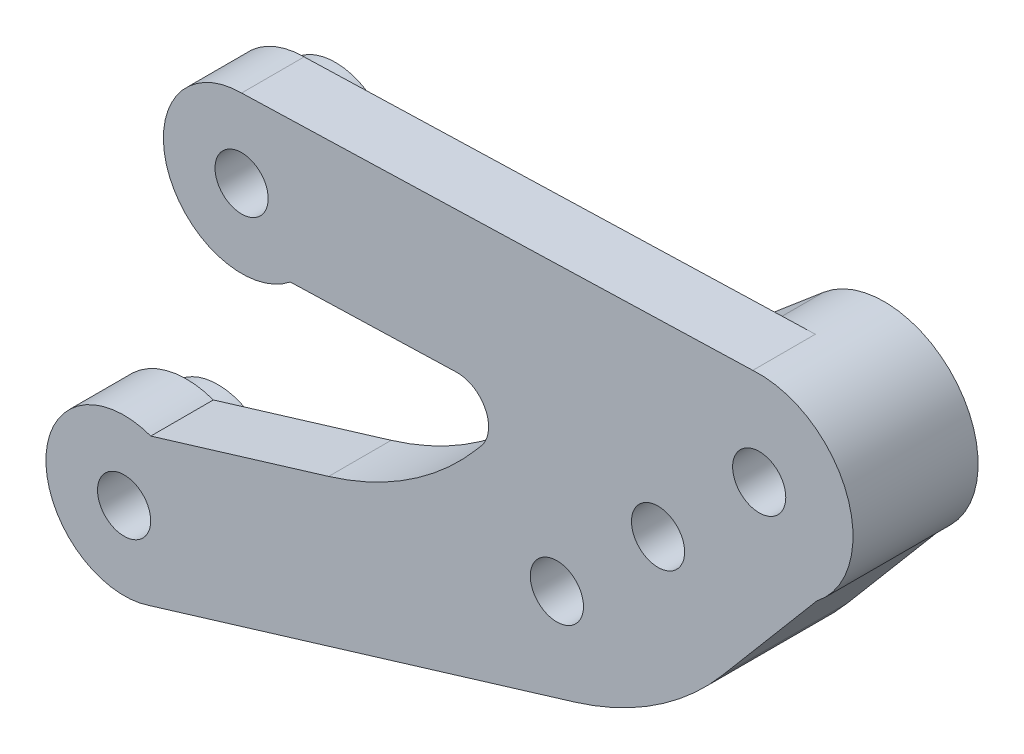
ISO-10303-21;
HEADER;
FILE_DESCRIPTION(('STEP AP214'),'2;1');
FILE_NAME('part.step','',(''),(''),'','','');
FILE_SCHEMA(('AUTOMOTIVE_DESIGN { 1 0 10303 214 1 1 1 1 }'));
ENDSEC;
DATA;
#1=APPLICATION_CONTEXT('core data for automotive mechanical design processes');
#2=APPLICATION_PROTOCOL_DEFINITION('international standard','automotive_design',2000,#1);
#3=PRODUCT_CONTEXT('',#1,'mechanical');
#4=PRODUCT('Part','Part','',(#3));
#5=PRODUCT_RELATED_PRODUCT_CATEGORY('part','',(#4));
#6=PRODUCT_DEFINITION_FORMATION('','',#4);
#7=PRODUCT_DEFINITION_CONTEXT('part definition',#1,'design');
#8=PRODUCT_DEFINITION('design','',#6,#7);
#9=PRODUCT_DEFINITION_SHAPE('','',#8);
#10=(LENGTH_UNIT() NAMED_UNIT(*) SI_UNIT(.MILLI.,.METRE.));
#11=(NAMED_UNIT(*) PLANE_ANGLE_UNIT() SI_UNIT($,.RADIAN.));
#12=(NAMED_UNIT(*) SI_UNIT($,.STERADIAN.) SOLID_ANGLE_UNIT());
#13=UNCERTAINTY_MEASURE_WITH_UNIT(LENGTH_MEASURE(1.E-05),#10,'distance_accuracy_value','');
#14=(GEOMETRIC_REPRESENTATION_CONTEXT(3) GLOBAL_UNCERTAINTY_ASSIGNED_CONTEXT((#13)) GLOBAL_UNIT_ASSIGNED_CONTEXT((#10,
#11,#12)) REPRESENTATION_CONTEXT('',''));
#15=CARTESIAN_POINT('',(0.,0.,0.));
#16=DIRECTION('',(0.,0.,1.));
#17=DIRECTION('',(1.,0.,0.));
#18=AXIS2_PLACEMENT_3D('',#15,#16,#17);
#19=CARTESIAN_POINT('',(0.,0.,-6.));
#20=DIRECTION('',(0.,0.,-1.));
#21=DIRECTION('',(1.,0.,0.));
#22=AXIS2_PLACEMENT_3D('',#19,#20,#21);
#23=PLANE('',#22);
#24=CARTESIAN_POINT('',(7.51288670694863,21.6007739057783,-6.));
#25=DIRECTION('',(0.,0.,1.));
#26=DIRECTION('',(1.,0.,0.));
#27=AXIS2_PLACEMENT_3D('',#24,#25,#26);
#28=CIRCLE('',#27,3.7);
#29=CARTESIAN_POINT('',(11.2128867069486,21.6007739057783,-6.));
#30=VERTEX_POINT('',#29);
#31=EDGE_CURVE('E219',#30,#30,#28,.T.);
#32=ORIENTED_EDGE('',*,*,#31,.T.);
#33=EDGE_LOOP('',(#32));
#34=FACE_BOUND('',#33,.T.);
#35=DIRECTION('',(0.762847733091093,0.646578174792329,0.));
#36=VECTOR('',#35,1.);
#37=CARTESIAN_POINT('',(36.7334177781984,26.1778604060383,-6.));
#38=LINE('',#37,#36);
#39=CARTESIAN_POINT('',(21.6839891931415,13.4221928670333,-6.));
#40=VERTEX_POINT('',#39);
#41=CARTESIAN_POINT('',(36.7334177781984,26.1778604060383,-6.));
#42=VERTEX_POINT('',#41);
#43=EDGE_CURVE('E171',#40,#42,#38,.T.);
#44=ORIENTED_EDGE('',*,*,#43,.F.);
#45=CARTESIAN_POINT('',(7.27186776558407,27.2890871104225,-6.));
#46=DIRECTION('',(0.,0.,1.));
#47=DIRECTION('',(1.,0.,0.));
#48=AXIS2_PLACEMENT_3D('',#45,#46,#47);
#49=CIRCLE('',#48,20.);
#50=CARTESIAN_POINT('',(22.5414357724455,14.3724198590053,-6.));
#51=VERTEX_POINT('',#50);
#52=EDGE_CURVE('E212',#51,#40,#49,.F.);
#53=ORIENTED_EDGE('',*,*,#52,.F.);
#54=DIRECTION('',(-0.645833362570859,-0.763478400343073,0.));
#55=VECTOR('',#54,1.);
#56=CARTESIAN_POINT('',(6.0526361731001,-5.11998030374497,-6.));
#57=LINE('',#56,#55);
#58=CARTESIAN_POINT('',(22.8356424846143,14.7202192806435,-6.));
#59=VERTEX_POINT('',#58);
#60=EDGE_CURVE('E240',#59,#51,#57,.T.);
#61=ORIENTED_EDGE('',*,*,#60,.F.);
#62=CARTESIAN_POINT('',(21.3086856839282,16.0118860057853,-6.));
#63=DIRECTION('',(0.,0.,1.));
#64=DIRECTION('',(1.,0.,0.));
#65=AXIS2_PLACEMENT_3D('',#62,#63,#64);
#66=CIRCLE('',#65,2.);
#67=CARTESIAN_POINT('',(21.248388262694,18.0109768543943,-6.));
#68=VERTEX_POINT('',#67);
#69=EDGE_CURVE('E52',#68,#59,#66,.F.);
#70=ORIENTED_EDGE('',*,*,#69,.F.);
#71=DIRECTION('',(0.999545424304533,0.0301487106170736,0.));
#72=VECTOR('',#71,1.);
#73=CARTESIAN_POINT('',(-0.523447280000722,17.3542855691174,-6.));
#74=LINE('',#73,#72);
#75=CARTESIAN_POINT('',(10.6291548266564,17.6906750571438,-6.));
#76=VERTEX_POINT('',#75);
#77=EDGE_CURVE('E245',#76,#68,#74,.T.);
#78=ORIENTED_EDGE('',*,*,#77,.F.);
#79=CARTESIAN_POINT('',(7.51288670694863,21.6007739057783,-6.));
#80=DIRECTION('',(0.,0.,1.));
#81=DIRECTION('',(1.,0.,0.));
#82=AXIS2_PLACEMENT_3D('',#79,#80,#81);
#83=CIRCLE('',#82,5.);
#84=CARTESIAN_POINT('',(7.51288670694863,26.6007739057783,-6.));
#85=VERTEX_POINT('',#84);
#86=EDGE_CURVE('E252',#85,#76,#83,.T.);
#87=ORIENTED_EDGE('',*,*,#86,.F.);
#88=DIRECTION('',(0.999545424304533,0.0301487106170735,0.));
#89=VECTOR('',#88,1.);
#90=CARTESIAN_POINT('',(-0.794785675554382,26.3501943878582,-6.));
#91=LINE('',#90,#89);
#92=CARTESIAN_POINT('',(40.203783053973,27.5868105078317,-6.));
#93=VERTEX_POINT('',#92);
#94=EDGE_CURVE('E311',#85,#93,#91,.T.);
#95=ORIENTED_EDGE('',*,*,#94,.T.);
#96=CARTESIAN_POINT('',(40.6128867069486,21.6007739057783,-6.));
#97=DIRECTION('',(0.,0.,-1.));
#98=DIRECTION('',(-1.,0.,0.));
#99=AXIS2_PLACEMENT_3D('',#96,#97,#98);
#100=CIRCLE('',#99,6.);
#101=EDGE_CURVE('E306',#42,#93,#100,.T.);
#102=ORIENTED_EDGE('',*,*,#101,.F.);
#103=EDGE_LOOP('',(#44,#53,#61,#70,#78,#87,#95,#102));
#104=FACE_BOUND('',#103,.T.);
#105=ADVANCED_FACE('F43',(#34,#104),#23,.T.);
#106=CARTESIAN_POINT('',(0.,0.,-6.));
#107=DIRECTION('',(0.,0.,1.));
#108=DIRECTION('',(1.,0.,0.));
#109=AXIS2_PLACEMENT_3D('',#106,#107,#108);
#110=CIRCLE('',#109,3.7);
#111=CARTESIAN_POINT('',(3.7,0.,-6.));
#112=VERTEX_POINT('',#111);
#113=EDGE_CURVE('E223',#112,#112,#110,.T.);
#114=ORIENTED_EDGE('',*,*,#113,.T.);
#115=EDGE_LOOP('',(#114));
#116=FACE_BOUND('',#115,.T.);
#117=DIRECTION('',(0.956912492894943,0.290376446947038,0.));
#118=VECTOR('',#117,1.);
#119=CARTESIAN_POINT('',(1.45139171596717,-4.78294599887616,-6.));
#120=LINE('',#119,#118);
#121=CARTESIAN_POINT('',(1.57575227360064,-4.74520861208887,-6.));
#122=VERTEX_POINT('',#121);
#123=CARTESIAN_POINT('',(28.8076552815149,3.5183508019198,-6.));
#124=VERTEX_POINT('',#123);
#125=EDGE_CURVE('E259',#122,#124,#120,.T.);
#126=ORIENTED_EDGE('',*,*,#125,.F.);
#127=CARTESIAN_POINT('',(0.,0.,-6.));
#128=DIRECTION('',(0.,0.,1.));
#129=DIRECTION('',(1.,0.,0.));
#130=AXIS2_PLACEMENT_3D('',#127,#128,#129);
#131=CIRCLE('',#130,5.);
#132=CARTESIAN_POINT('',(1.70658461953951,4.69974136909162,-6.));
#133=VERTEX_POINT('',#132);
#134=EDGE_CURVE('E250',#133,#122,#131,.T.);
#135=ORIENTED_EDGE('',*,*,#134,.F.);
#136=DIRECTION('',(-0.956912492894943,-0.290376446947038,0.));
#137=VECTOR('',#136,1.);
#138=CARTESIAN_POINT('',(-1.16199630655618,3.82926643717832,-6.));
#139=LINE('',#138,#137);
#140=CARTESIAN_POINT('',(13.0793967045248,8.15083725252361,-6.));
#141=VERTEX_POINT('',#140);
#142=EDGE_CURVE('E244',#141,#133,#139,.T.);
#143=ORIENTED_EDGE('',*,*,#142,.F.);
#144=EDGE_CURVE('E211',#40,#141,#49,.F.);
#145=ORIENTED_EDGE('',*,*,#144,.F.);
#146=CARTESIAN_POINT('',(26.9360632309097,9.68603359319531,-6.));
#147=DIRECTION('',(0.,0.,-1.));
#148=DIRECTION('',(-1.,0.,0.));
#149=AXIS2_PLACEMENT_3D('',#146,#147,#148);
#150=CIRCLE('',#149,6.44539896497374);
#151=EDGE_CURVE('E336',#124,#40,#150,.T.);
#152=ORIENTED_EDGE('',*,*,#151,.F.);
#153=EDGE_LOOP('',(#126,#135,#143,#145,#152));
#154=FACE_BOUND('',#153,.T.);
#155=ADVANCED_FACE('F399',(#116,#154),#23,.T.);
#156=CARTESIAN_POINT('',(-0.794785675554382,26.3501943878582,-2.));
#157=DIRECTION('',(0.0301487106170735,-0.999545424304533,0.));
#158=DIRECTION('',(0.999545424304533,0.0301487106170735,0.));
#159=AXIS2_PLACEMENT_3D('',#156,#157,#158);
#160=PLANE('',#159);
#161=DIRECTION('',(0.,0.,-1.));
#162=VECTOR('',#161,1.);
#163=CARTESIAN_POINT('',(7.51288670694863,26.6007739057783,-2.));
#164=LINE('',#163,#162);
#165=CARTESIAN_POINT('',(7.51288670694863,26.6007739057783,-2.));
#166=VERTEX_POINT('',#165);
#167=EDGE_CURVE('E193',#166,#85,#164,.T.);
#168=ORIENTED_EDGE('',*,*,#167,.F.);
#169=DIRECTION('',(0.999545424304533,0.0301487106170735,0.));
#170=VECTOR('',#169,1.);
#171=CARTESIAN_POINT('',(-0.794785675554382,26.3501943878582,-2.));
#172=LINE('',#171,#170);
#173=CARTESIAN_POINT('',(40.203783053973,27.5868105078317,-2.));
#174=VERTEX_POINT('',#173);
#175=EDGE_CURVE('E275',#166,#174,#172,.T.);
#176=ORIENTED_EDGE('',*,*,#175,.T.);
#177=DIRECTION('',(0.,0.,-1.));
#178=VECTOR('',#177,1.);
#179=CARTESIAN_POINT('',(40.203783053973,27.5868105078317,-2.));
#180=LINE('',#179,#178);
#181=EDGE_CURVE('E177',#174,#93,#180,.T.);
#182=ORIENTED_EDGE('',*,*,#181,.T.);
#183=ORIENTED_EDGE('',*,*,#94,.F.);
#184=EDGE_LOOP('',(#168,#176,#182,#183));
#185=FACE_BOUND('',#184,.T.);
#186=ADVANCED_FACE('F310',(#185),#160,.F.);
#187=CARTESIAN_POINT('',(40.6128867069486,21.6007739057783,-2.));
#188=DIRECTION('',(0.,0.,-1.));
#189=DIRECTION('',(1.,0.,0.));
#190=AXIS2_PLACEMENT_3D('',#187,#188,#189);
#191=CYLINDRICAL_SURFACE('',#190,6.);
#192=ORIENTED_EDGE('',*,*,#181,.F.);
#193=CARTESIAN_POINT('',(40.6128867069486,21.6007739057783,-2.));
#194=DIRECTION('',(0.,0.,1.));
#195=DIRECTION('',(1.,0.,0.));
#196=AXIS2_PLACEMENT_3D('',#193,#194,#195);
#197=CIRCLE('',#196,6.);
#198=CARTESIAN_POINT('',(44.2966352413055,16.8647421559245,-2.));
#199=VERTEX_POINT('',#198);
#200=EDGE_CURVE('E175',#199,#174,#197,.T.);
#201=ORIENTED_EDGE('',*,*,#200,.F.);
#202=DIRECTION('',(0.,0.,-1.));
#203=VECTOR('',#202,1.);
#204=CARTESIAN_POINT('',(44.2966352413055,16.8647421559245,-2.));
#205=LINE('',#204,#203);
#206=CARTESIAN_POINT('',(44.2966352413055,16.8647421559245,-10.));
#207=VERTEX_POINT('',#206);
#208=EDGE_CURVE('E154',#199,#207,#205,.T.);
#209=ORIENTED_EDGE('',*,*,#208,.T.);
#210=CARTESIAN_POINT('',(40.6128867069486,21.6007739057783,-10.));
#211=DIRECTION('',(0.,0.,-1.));
#212=DIRECTION('',(-1.,0.,0.));
#213=AXIS2_PLACEMENT_3D('',#210,#211,#212);
#214=CIRCLE('',#213,6.);
#215=CARTESIAN_POINT('',(36.7334177781984,26.1778604060383,-10.));
#216=VERTEX_POINT('',#215);
#217=EDGE_CURVE('E162',#216,#207,#214,.T.);
#218=ORIENTED_EDGE('',*,*,#217,.F.);
#219=DIRECTION('',(0.,0.,1.));
#220=VECTOR('',#219,1.);
#221=CARTESIAN_POINT('',(36.7334177781984,26.1778604060383,-10.));
#222=LINE('',#221,#220);
#223=EDGE_CURVE('E322',#216,#42,#222,.T.);
#224=ORIENTED_EDGE('',*,*,#223,.T.);
#225=ORIENTED_EDGE('',*,*,#101,.T.);
#226=EDGE_LOOP('',(#192,#201,#209,#218,#224,#225));
#227=FACE_BOUND('',#226,.T.);
#228=ADVANCED_FACE('F174',(#227),#191,.T.);
#229=CARTESIAN_POINT('',(17.5048121782462,-14.8074807423079,-2.));
#230=DIRECTION('',(0.763478400343073,-0.645833362570859,0.));
#231=DIRECTION('',(0.645833362570859,0.763478400343073,0.));
#232=AXIS2_PLACEMENT_3D('',#229,#230,#231);
#233=PLANE('',#232);
#234=ORIENTED_EDGE('',*,*,#208,.F.);
#235=DIRECTION('',(0.645833362570859,0.763478400343073,0.));
#236=VECTOR('',#235,1.);
#237=CARTESIAN_POINT('',(17.5048121782462,-14.8074807423079,-2.));
#238=LINE('',#237,#236);
#239=CARTESIAN_POINT('',(38.2696943494356,9.7399334084015,-2.));
#240=VERTEX_POINT('',#239);
#241=EDGE_CURVE('E298',#240,#199,#238,.T.);
#242=ORIENTED_EDGE('',*,*,#241,.F.);
#243=DIRECTION('',(0.,0.,-1.));
#244=VECTOR('',#243,1.);
#245=CARTESIAN_POINT('',(38.2696943494356,9.73993340840149,-2.));
#246=LINE('',#245,#244);
#247=CARTESIAN_POINT('',(38.2696943494356,9.7399334084015,-10.));
#248=VERTEX_POINT('',#247);
#249=EDGE_CURVE('E157',#248,#240,#246,.F.);
#250=ORIENTED_EDGE('',*,*,#249,.F.);
#251=DIRECTION('',(-0.645833362570859,-0.763478400343073,0.));
#252=VECTOR('',#251,1.);
#253=CARTESIAN_POINT('',(44.2966352413055,16.8647421559245,-10.));
#254=LINE('',#253,#252);
#255=EDGE_CURVE('E149',#207,#248,#254,.T.);
#256=ORIENTED_EDGE('',*,*,#255,.F.);
#257=EDGE_LOOP('',(#234,#242,#250,#256));
#258=FACE_BOUND('',#257,.T.);
#259=ADVANCED_FACE('F151',(#258),#233,.T.);
#260=CARTESIAN_POINT('',(1.45139171596717,-4.78294599887616,-2.));
#261=DIRECTION('',(0.290376446947038,-0.956912492894943,0.));
#262=DIRECTION('',(0.956912492894943,0.290376446947038,0.));
#263=AXIS2_PLACEMENT_3D('',#260,#261,#262);
#264=PLANE('',#263);
#265=DIRECTION('',(0.956912492894943,0.290376446947038,0.));
#266=VECTOR('',#265,1.);
#267=CARTESIAN_POINT('',(1.45139171596717,-4.78294599887616,-2.));
#268=LINE('',#267,#266);
#269=CARTESIAN_POINT('',(1.57575227360064,-4.74520861208887,-2.));
#270=VERTEX_POINT('',#269);
#271=CARTESIAN_POINT('',(28.8076552815149,3.5183508019198,-2.));
#272=VERTEX_POINT('',#271);
#273=EDGE_CURVE('E294',#270,#272,#268,.T.);
#274=ORIENTED_EDGE('',*,*,#273,.F.);
#275=DIRECTION('',(0.,0.,-1.));
#276=VECTOR('',#275,1.);
#277=CARTESIAN_POINT('',(1.57575227360064,-4.74520861208887,-2.));
#278=LINE('',#277,#276);
#279=EDGE_CURVE('E178',#270,#122,#278,.T.);
#280=ORIENTED_EDGE('',*,*,#279,.T.);
#281=ORIENTED_EDGE('',*,*,#125,.T.);
#282=DIRECTION('',(0.,0.,-1.));
#283=VECTOR('',#282,1.);
#284=CARTESIAN_POINT('',(28.8076552815149,3.5183508019198,-2.));
#285=LINE('',#284,#283);
#286=EDGE_CURVE('E202',#272,#124,#285,.T.);
#287=ORIENTED_EDGE('',*,*,#286,.F.);
#288=EDGE_LOOP('',(#274,#280,#281,#287));
#289=FACE_BOUND('',#288,.T.);
#290=ADVANCED_FACE('F418',(#289),#264,.T.);
#291=CARTESIAN_POINT('',(0.,0.,-2.));
#292=DIRECTION('',(0.,0.,-1.));
#293=DIRECTION('',(1.,0.,0.));
#294=AXIS2_PLACEMENT_3D('',#291,#292,#293);
#295=CYLINDRICAL_SURFACE('',#294,5.);
#296=ORIENTED_EDGE('',*,*,#279,.F.);
#297=CARTESIAN_POINT('',(0.,0.,-2.));
#298=DIRECTION('',(0.,0.,1.));
#299=DIRECTION('',(1.,0.,0.));
#300=AXIS2_PLACEMENT_3D('',#297,#298,#299);
#301=CIRCLE('',#300,5.);
#302=CARTESIAN_POINT('',(1.70658461953951,4.69974136909162,-2.));
#303=VERTEX_POINT('',#302);
#304=EDGE_CURVE('E291',#303,#270,#301,.T.);
#305=ORIENTED_EDGE('',*,*,#304,.F.);
#306=DIRECTION('',(0.,0.,-1.));
#307=VECTOR('',#306,1.);
#308=CARTESIAN_POINT('',(1.70658461953951,4.69974136909162,-2.));
#309=LINE('',#308,#307);
#310=EDGE_CURVE('E184',#303,#133,#309,.T.);
#311=ORIENTED_EDGE('',*,*,#310,.T.);
#312=ORIENTED_EDGE('',*,*,#134,.T.);
#313=EDGE_LOOP('',(#296,#305,#311,#312));
#314=FACE_BOUND('',#313,.T.);
#315=ADVANCED_FACE('F421',(#314),#295,.T.);
#316=CARTESIAN_POINT('',(-1.16199630655618,3.82926643717832,-2.));
#317=DIRECTION('',(-0.290376446947038,0.956912492894943,0.));
#318=DIRECTION('',(-0.956912492894943,-0.290376446947038,0.));
#319=AXIS2_PLACEMENT_3D('',#316,#317,#318);
#320=PLANE('',#319);
#321=ORIENTED_EDGE('',*,*,#142,.T.);
#322=ORIENTED_EDGE('',*,*,#310,.F.);
#323=DIRECTION('',(-0.956912492894943,-0.290376446947038,0.));
#324=VECTOR('',#323,1.);
#325=CARTESIAN_POINT('',(-1.16199630655618,3.82926643717832,-2.));
#326=LINE('',#325,#324);
#327=CARTESIAN_POINT('',(13.0793967045248,8.15083725252361,-2.));
#328=VERTEX_POINT('',#327);
#329=EDGE_CURVE('E288',#328,#303,#326,.T.);
#330=ORIENTED_EDGE('',*,*,#329,.F.);
#331=DIRECTION('',(0.,0.,-1.));
#332=VECTOR('',#331,1.);
#333=CARTESIAN_POINT('',(13.0793967045248,8.15083725252361,-2.));
#334=LINE('',#333,#332);
#335=EDGE_CURVE('E198',#141,#328,#334,.F.);
#336=ORIENTED_EDGE('',*,*,#335,.F.);
#337=EDGE_LOOP('',(#321,#322,#330,#336));
#338=FACE_BOUND('',#337,.T.);
#339=ADVANCED_FACE('F425',(#338),#320,.T.);
#340=CARTESIAN_POINT('',(6.0526361731001,-5.11998030374497,-2.));
#341=DIRECTION('',(-0.763478400343073,0.645833362570859,0.));
#342=DIRECTION('',(-0.645833362570859,-0.763478400343073,0.));
#343=AXIS2_PLACEMENT_3D('',#340,#341,#342);
#344=PLANE('',#343);
#345=ORIENTED_EDGE('',*,*,#60,.T.);
#346=DIRECTION('',(0.,0.,-1.));
#347=VECTOR('',#346,1.);
#348=CARTESIAN_POINT('',(22.5414357724455,14.3724198590053,-6.));
#349=LINE('',#348,#347);
#350=CARTESIAN_POINT('',(22.5414357724455,14.3724198590053,-2.));
#351=VERTEX_POINT('',#350);
#352=EDGE_CURVE('E182',#351,#51,#349,.T.);
#353=ORIENTED_EDGE('',*,*,#352,.F.);
#354=DIRECTION('',(-0.645833362570859,-0.763478400343073,0.));
#355=VECTOR('',#354,1.);
#356=CARTESIAN_POINT('',(6.0526361731001,-5.11998030374497,-2.));
#357=LINE('',#356,#355);
#358=CARTESIAN_POINT('',(22.8356424846143,14.7202192806435,-2.));
#359=VERTEX_POINT('',#358);
#360=EDGE_CURVE('E285',#359,#351,#357,.T.);
#361=ORIENTED_EDGE('',*,*,#360,.F.);
#362=DIRECTION('',(0.,0.,-1.));
#363=VECTOR('',#362,1.);
#364=CARTESIAN_POINT('',(22.8356424846143,14.7202192806435,-2.));
#365=LINE('',#364,#363);
#366=EDGE_CURVE('E59',#59,#359,#365,.F.);
#367=ORIENTED_EDGE('',*,*,#366,.F.);
#368=EDGE_LOOP('',(#345,#353,#361,#367));
#369=FACE_BOUND('',#368,.T.);
#370=ADVANCED_FACE('F429',(#369),#344,.T.);
#371=CARTESIAN_POINT('',(-0.523447280000722,17.3542855691174,-2.));
#372=DIRECTION('',(0.0301487106170736,-0.999545424304533,0.));
#373=DIRECTION('',(0.999545424304533,0.0301487106170736,0.));
#374=AXIS2_PLACEMENT_3D('',#371,#372,#373);
#375=PLANE('',#374);
#376=DIRECTION('',(0.999545424304533,0.0301487106170736,0.));
#377=VECTOR('',#376,1.);
#378=CARTESIAN_POINT('',(-0.523447280000722,17.3542855691174,-2.));
#379=LINE('',#378,#377);
#380=CARTESIAN_POINT('',(10.6291548266564,17.6906750571438,-2.));
#381=VERTEX_POINT('',#380);
#382=CARTESIAN_POINT('',(21.248388262694,18.0109768543943,-2.));
#383=VERTEX_POINT('',#382);
#384=EDGE_CURVE('E282',#381,#383,#379,.T.);
#385=ORIENTED_EDGE('',*,*,#384,.F.);
#386=DIRECTION('',(0.,0.,-1.));
#387=VECTOR('',#386,1.);
#388=CARTESIAN_POINT('',(10.6291548266564,17.6906750571438,-2.));
#389=LINE('',#388,#387);
#390=EDGE_CURVE('E190',#381,#76,#389,.T.);
#391=ORIENTED_EDGE('',*,*,#390,.T.);
#392=ORIENTED_EDGE('',*,*,#77,.T.);
#393=DIRECTION('',(0.,0.,-1.));
#394=VECTOR('',#393,1.);
#395=CARTESIAN_POINT('',(21.248388262694,18.0109768543943,-6.));
#396=LINE('',#395,#394);
#397=EDGE_CURVE('E227',#383,#68,#396,.T.);
#398=ORIENTED_EDGE('',*,*,#397,.F.);
#399=EDGE_LOOP('',(#385,#391,#392,#398));
#400=FACE_BOUND('',#399,.T.);
#401=ADVANCED_FACE('F319',(#400),#375,.T.);
#402=CARTESIAN_POINT('',(7.51288670694863,21.6007739057783,-2.));
#403=DIRECTION('',(0.,0.,-1.));
#404=DIRECTION('',(1.,0.,0.));
#405=AXIS2_PLACEMENT_3D('',#402,#403,#404);
#406=CYLINDRICAL_SURFACE('',#405,1.7);
#407=CARTESIAN_POINT('',(7.51288670694863,21.6007739057783,-2.));
#408=DIRECTION('',(0.,0.,1.));
#409=DIRECTION('',(1.,0.,0.));
#410=AXIS2_PLACEMENT_3D('',#407,#408,#409);
#411=CIRCLE('',#410,1.7);
#412=CARTESIAN_POINT('',(9.21288670694863,21.6007739057783,-2.));
#413=VERTEX_POINT('',#412);
#414=EDGE_CURVE('E271',#413,#413,#411,.T.);
#415=ORIENTED_EDGE('',*,*,#414,.T.);
#416=EDGE_LOOP('',(#415));
#417=FACE_BOUND('',#416,.T.);
#418=CARTESIAN_POINT('',(7.51288670694863,21.6007739057783,-8.));
#419=DIRECTION('',(0.,0.,-1.));
#420=DIRECTION('',(-1.,0.,0.));
#421=AXIS2_PLACEMENT_3D('',#418,#419,#420);
#422=CIRCLE('',#421,1.7);
#423=CARTESIAN_POINT('',(5.81288670694863,21.6007739057783,-8.));
#424=VERTEX_POINT('',#423);
#425=EDGE_CURVE('E357',#424,#424,#422,.T.);
#426=ORIENTED_EDGE('',*,*,#425,.T.);
#427=EDGE_LOOP('',(#426));
#428=FACE_BOUND('',#427,.T.);
#429=ADVANCED_FACE('F435',(#417,#428),#406,.F.);
#430=CARTESIAN_POINT('',(40.6128867069486,21.6007739057783,-2.));
#431=DIRECTION('',(0.,0.,-1.));
#432=DIRECTION('',(1.,0.,0.));
#433=AXIS2_PLACEMENT_3D('',#430,#431,#432);
#434=CYLINDRICAL_SURFACE('',#433,1.7);
#435=CARTESIAN_POINT('',(40.6128867069486,21.6007739057783,-2.));
#436=DIRECTION('',(0.,0.,1.));
#437=DIRECTION('',(1.,0.,0.));
#438=AXIS2_PLACEMENT_3D('',#435,#436,#437);
#439=CIRCLE('',#438,1.7);
#440=CARTESIAN_POINT('',(42.3128867069486,21.6007739057783,-2.));
#441=VERTEX_POINT('',#440);
#442=EDGE_CURVE('E267',#441,#441,#439,.T.);
#443=ORIENTED_EDGE('',*,*,#442,.T.);
#444=EDGE_LOOP('',(#443));
#445=FACE_BOUND('',#444,.T.);
#446=CARTESIAN_POINT('',(40.6128867069486,21.6007739057783,-10.));
#447=DIRECTION('',(0.,0.,-1.));
#448=DIRECTION('',(-1.,0.,0.));
#449=AXIS2_PLACEMENT_3D('',#446,#447,#448);
#450=CIRCLE('',#449,1.7);
#451=CARTESIAN_POINT('',(38.9128867069486,21.6007739057783,-10.));
#452=VERTEX_POINT('',#451);
#453=EDGE_CURVE('E342',#452,#452,#450,.T.);
#454=ORIENTED_EDGE('',*,*,#453,.T.);
#455=EDGE_LOOP('',(#454));
#456=FACE_BOUND('',#455,.T.);
#457=ADVANCED_FACE('F443',(#445,#456),#434,.F.);
#458=CARTESIAN_POINT('',(0.,0.,-2.));
#459=DIRECTION('',(0.,0.,-1.));
#460=DIRECTION('',(1.,0.,0.));
#461=AXIS2_PLACEMENT_3D('',#458,#459,#460);
#462=CYLINDRICAL_SURFACE('',#461,1.7);
#463=CARTESIAN_POINT('',(0.,0.,-2.));
#464=DIRECTION('',(0.,0.,1.));
#465=DIRECTION('',(1.,0.,0.));
#466=AXIS2_PLACEMENT_3D('',#463,#464,#465);
#467=CIRCLE('',#466,1.7);
#468=CARTESIAN_POINT('',(1.7,0.,-2.));
#469=VERTEX_POINT('',#468);
#470=EDGE_CURVE('E263',#469,#469,#467,.T.);
#471=ORIENTED_EDGE('',*,*,#470,.T.);
#472=EDGE_LOOP('',(#471));
#473=FACE_BOUND('',#472,.T.);
#474=CARTESIAN_POINT('',(0.,0.,-8.));
#475=DIRECTION('',(0.,0.,-1.));
#476=DIRECTION('',(-1.,0.,0.));
#477=AXIS2_PLACEMENT_3D('',#474,#475,#476);
#478=CIRCLE('',#477,1.7);
#479=CARTESIAN_POINT('',(-1.7,0.,-8.));
#480=VERTEX_POINT('',#479);
#481=EDGE_CURVE('E365',#480,#480,#478,.T.);
#482=ORIENTED_EDGE('',*,*,#481,.T.);
#483=EDGE_LOOP('',(#482));
#484=FACE_BOUND('',#483,.T.);
#485=ADVANCED_FACE('F438',(#473,#484),#462,.F.);
#486=CARTESIAN_POINT('',(7.51288670694863,21.6007739057783,-2.));
#487=DIRECTION('',(0.,0.,-1.));
#488=DIRECTION('',(1.,0.,0.));
#489=AXIS2_PLACEMENT_3D('',#486,#487,#488);
#490=CYLINDRICAL_SURFACE('',#489,5.);
#491=ORIENTED_EDGE('',*,*,#390,.F.);
#492=CARTESIAN_POINT('',(7.51288670694863,21.6007739057783,-2.));
#493=DIRECTION('',(0.,0.,1.));
#494=DIRECTION('',(1.,0.,0.));
#495=AXIS2_PLACEMENT_3D('',#492,#493,#494);
#496=CIRCLE('',#495,5.);
#497=EDGE_CURVE('E279',#166,#381,#496,.T.);
#498=ORIENTED_EDGE('',*,*,#497,.F.);
#499=ORIENTED_EDGE('',*,*,#167,.T.);
#500=ORIENTED_EDGE('',*,*,#86,.T.);
#501=EDGE_LOOP('',(#491,#498,#499,#500));
#502=FACE_BOUND('',#501,.T.);
#503=ADVANCED_FACE('F316',(#502),#490,.T.);
#504=CARTESIAN_POINT('',(0.,0.,-2.));
#505=DIRECTION('',(0.,0.,-1.));
#506=DIRECTION('',(1.,0.,0.));
#507=AXIS2_PLACEMENT_3D('',#504,#505,#506);
#508=PLANE('',#507);
#509=CARTESIAN_POINT('',(34.1437917556042,15.3437130533905,-2.));
#510=DIRECTION('',(0.,0.,1.));
#511=DIRECTION('',(1.,0.,0.));
#512=AXIS2_PLACEMENT_3D('',#509,#510,#511);
#513=CIRCLE('',#512,1.7);
#514=CARTESIAN_POINT('',(35.8437917556042,15.3437130533905,-2.));
#515=VERTEX_POINT('',#514);
#516=EDGE_CURVE('E377',#515,#515,#513,.T.);
#517=ORIENTED_EDGE('',*,*,#516,.F.);
#518=EDGE_LOOP('',(#517));
#519=FACE_BOUND('',#518,.T.);
#520=CARTESIAN_POINT('',(27.6746968042595,9.08665220100248,-2.));
#521=DIRECTION('',(0.,0.,1.));
#522=DIRECTION('',(1.,0.,0.));
#523=AXIS2_PLACEMENT_3D('',#520,#521,#522);
#524=CIRCLE('',#523,1.7);
#525=CARTESIAN_POINT('',(29.3746968042595,9.08665220100248,-2.));
#526=VERTEX_POINT('',#525);
#527=EDGE_CURVE('E369',#526,#526,#524,.T.);
#528=ORIENTED_EDGE('',*,*,#527,.F.);
#529=EDGE_LOOP('',(#528));
#530=FACE_BOUND('',#529,.T.);
#531=ORIENTED_EDGE('',*,*,#470,.F.);
#532=EDGE_LOOP('',(#531));
#533=FACE_BOUND('',#532,.T.);
#534=ORIENTED_EDGE('',*,*,#442,.F.);
#535=EDGE_LOOP('',(#534));
#536=FACE_BOUND('',#535,.T.);
#537=ORIENTED_EDGE('',*,*,#414,.F.);
#538=EDGE_LOOP('',(#537));
#539=FACE_BOUND('',#538,.T.);
#540=ORIENTED_EDGE('',*,*,#241,.T.);
#541=ORIENTED_EDGE('',*,*,#200,.T.);
#542=ORIENTED_EDGE('',*,*,#175,.F.);
#543=ORIENTED_EDGE('',*,*,#497,.T.);
#544=ORIENTED_EDGE('',*,*,#384,.T.);
#545=CARTESIAN_POINT('',(21.3086856839282,16.0118860057853,-2.));
#546=DIRECTION('',(0.,0.,1.));
#547=DIRECTION('',(1.,0.,0.));
#548=AXIS2_PLACEMENT_3D('',#545,#546,#547);
#549=CIRCLE('',#548,2.);
#550=EDGE_CURVE('E11',#359,#383,#549,.T.);
#551=ORIENTED_EDGE('',*,*,#550,.F.);
#552=ORIENTED_EDGE('',*,*,#360,.T.);
#553=CARTESIAN_POINT('',(7.27186776558407,27.2890871104225,-2.));
#554=DIRECTION('',(0.,0.,1.));
#555=DIRECTION('',(1.,0.,0.));
#556=AXIS2_PLACEMENT_3D('',#553,#554,#555);
#557=CIRCLE('',#556,20.);
#558=EDGE_CURVE('E216',#328,#351,#557,.T.);
#559=ORIENTED_EDGE('',*,*,#558,.F.);
#560=ORIENTED_EDGE('',*,*,#329,.T.);
#561=ORIENTED_EDGE('',*,*,#304,.T.);
#562=ORIENTED_EDGE('',*,*,#273,.T.);
#563=CARTESIAN_POINT('',(23.0001263425741,22.6566006598187,-2.));
#564=DIRECTION('',(0.,0.,1.));
#565=DIRECTION('',(1.,0.,0.));
#566=AXIS2_PLACEMENT_3D('',#563,#564,#565);
#567=CIRCLE('',#566,20.);
#568=EDGE_CURVE('E208',#240,#272,#567,.F.);
#569=ORIENTED_EDGE('',*,*,#568,.F.);
#570=EDGE_LOOP('',(#540,#541,#542,#543,#544,#551,#552,#559,#560,#561,#562,#569));
#571=FACE_BOUND('',#570,.T.);
#572=ADVANCED_FACE('F302',(#519,#530,#533,#536,#539,#571),#508,.F.);
#573=CARTESIAN_POINT('',(7.27186776558407,27.2890871104225,-2.));
#574=DIRECTION('',(0.,0.,1.));
#575=DIRECTION('',(-1.,0.,0.));
#576=AXIS2_PLACEMENT_3D('',#573,#574,#575);
#577=CYLINDRICAL_SURFACE('',#576,20.);
#578=ORIENTED_EDGE('',*,*,#558,.T.);
#579=ORIENTED_EDGE('',*,*,#352,.T.);
#580=ORIENTED_EDGE('',*,*,#52,.T.);
#581=ORIENTED_EDGE('',*,*,#144,.T.);
#582=ORIENTED_EDGE('',*,*,#335,.T.);
#583=EDGE_LOOP('',(#578,#579,#580,#581,#582));
#584=FACE_BOUND('',#583,.T.);
#585=ADVANCED_FACE('F412',(#584),#577,.F.);
#586=CARTESIAN_POINT('',(23.0001263425741,22.6566006598187,-2.));
#587=DIRECTION('',(0.,0.,-1.));
#588=DIRECTION('',(1.,0.,0.));
#589=AXIS2_PLACEMENT_3D('',#586,#587,#588);
#590=CYLINDRICAL_SURFACE('',#589,20.);
#591=ORIENTED_EDGE('',*,*,#568,.T.);
#592=ORIENTED_EDGE('',*,*,#286,.T.);
#593=DIRECTION('',(0.,0.,1.));
#594=VECTOR('',#593,1.);
#595=CARTESIAN_POINT('',(28.8076552815149,3.5183508019198,-10.));
#596=LINE('',#595,#594);
#597=CARTESIAN_POINT('',(28.8076552815149,3.5183508019198,-10.));
#598=VERTEX_POINT('',#597);
#599=EDGE_CURVE('E325',#598,#124,#596,.T.);
#600=ORIENTED_EDGE('',*,*,#599,.F.);
#601=CARTESIAN_POINT('',(23.0001263425741,22.6566006598188,-10.));
#602=DIRECTION('',(0.,0.,-1.));
#603=DIRECTION('',(-1.,0.,0.));
#604=AXIS2_PLACEMENT_3D('',#601,#602,#603);
#605=CIRCLE('',#604,20.0000000000001);
#606=EDGE_CURVE('E161',#248,#598,#605,.T.);
#607=ORIENTED_EDGE('',*,*,#606,.F.);
#608=ORIENTED_EDGE('',*,*,#249,.T.);
#609=EDGE_LOOP('',(#591,#592,#600,#607,#608));
#610=FACE_BOUND('',#609,.T.);
#611=ADVANCED_FACE('F452',(#610),#590,.T.);
#612=CARTESIAN_POINT('',(36.7334177781984,26.1778604060383,-10.));
#613=DIRECTION('',(-0.646578174792329,0.762847733091093,0.));
#614=DIRECTION('',(-0.762847733091093,-0.646578174792329,0.));
#615=AXIS2_PLACEMENT_3D('',#612,#613,#614);
#616=PLANE('',#615);
#617=ORIENTED_EDGE('',*,*,#43,.T.);
#618=ORIENTED_EDGE('',*,*,#223,.F.);
#619=DIRECTION('',(0.762847733091093,0.646578174792329,0.));
#620=VECTOR('',#619,1.);
#621=CARTESIAN_POINT('',(36.7334177781984,26.1778604060383,-10.));
#622=LINE('',#621,#620);
#623=CARTESIAN_POINT('',(21.6839891931415,13.4221928670333,-10.));
#624=VERTEX_POINT('',#623);
#625=EDGE_CURVE('E167',#624,#216,#622,.T.);
#626=ORIENTED_EDGE('',*,*,#625,.F.);
#627=DIRECTION('',(0.,0.,1.));
#628=VECTOR('',#627,1.);
#629=CARTESIAN_POINT('',(21.6839891931415,13.4221928670333,-10.));
#630=LINE('',#629,#628);
#631=EDGE_CURVE('E328',#624,#40,#630,.T.);
#632=ORIENTED_EDGE('',*,*,#631,.T.);
#633=EDGE_LOOP('',(#617,#618,#626,#632));
#634=FACE_BOUND('',#633,.T.);
#635=ADVANCED_FACE('F455',(#634),#616,.T.);
#636=CARTESIAN_POINT('',(26.9360632309097,9.68603359319531,-10.));
#637=DIRECTION('',(0.,0.,1.));
#638=DIRECTION('',(-1.,0.,0.));
#639=AXIS2_PLACEMENT_3D('',#636,#637,#638);
#640=CYLINDRICAL_SURFACE('',#639,6.44539896497374);
#641=ORIENTED_EDGE('',*,*,#151,.T.);
#642=ORIENTED_EDGE('',*,*,#631,.F.);
#643=CARTESIAN_POINT('',(26.9360632309097,9.68603359319531,-10.));
#644=DIRECTION('',(0.,0.,-1.));
#645=DIRECTION('',(-1.,0.,0.));
#646=AXIS2_PLACEMENT_3D('',#643,#644,#645);
#647=CIRCLE('',#646,6.44539896497374);
#648=EDGE_CURVE('E345',#598,#624,#647,.T.);
#649=ORIENTED_EDGE('',*,*,#648,.F.);
#650=ORIENTED_EDGE('',*,*,#599,.T.);
#651=EDGE_LOOP('',(#641,#642,#649,#650));
#652=FACE_BOUND('',#651,.T.);
#653=ADVANCED_FACE('F408',(#652),#640,.T.);
#654=CARTESIAN_POINT('',(40.6128867069486,21.6007739057783,-10.));
#655=DIRECTION('',(0.,0.,1.));
#656=DIRECTION('',(-1.,0.,0.));
#657=AXIS2_PLACEMENT_3D('',#654,#655,#656);
#658=PLANE('',#657);
#659=CARTESIAN_POINT('',(34.1437917556042,15.3437130533905,-10.));
#660=DIRECTION('',(0.,0.,1.));
#661=DIRECTION('',(1.,0.,0.));
#662=AXIS2_PLACEMENT_3D('',#659,#660,#661);
#663=CIRCLE('',#662,1.69999999999999);
#664=CARTESIAN_POINT('',(35.8437917556042,15.3437130533905,-10.));
#665=VERTEX_POINT('',#664);
#666=EDGE_CURVE('E381',#665,#665,#663,.T.);
#667=ORIENTED_EDGE('',*,*,#666,.T.);
#668=EDGE_LOOP('',(#667));
#669=FACE_BOUND('',#668,.T.);
#670=CARTESIAN_POINT('',(27.6746968042595,9.08665220100248,-10.));
#671=DIRECTION('',(0.,0.,1.));
#672=DIRECTION('',(1.,0.,0.));
#673=AXIS2_PLACEMENT_3D('',#670,#671,#672);
#674=CIRCLE('',#673,1.69999999999999);
#675=CARTESIAN_POINT('',(29.3746968042595,9.08665220100248,-10.));
#676=VERTEX_POINT('',#675);
#677=EDGE_CURVE('E373',#676,#676,#674,.T.);
#678=ORIENTED_EDGE('',*,*,#677,.T.);
#679=EDGE_LOOP('',(#678));
#680=FACE_BOUND('',#679,.T.);
#681=ORIENTED_EDGE('',*,*,#453,.F.);
#682=EDGE_LOOP('',(#681));
#683=FACE_BOUND('',#682,.T.);
#684=ORIENTED_EDGE('',*,*,#217,.T.);
#685=ORIENTED_EDGE('',*,*,#255,.T.);
#686=ORIENTED_EDGE('',*,*,#606,.T.);
#687=ORIENTED_EDGE('',*,*,#648,.T.);
#688=ORIENTED_EDGE('',*,*,#625,.T.);
#689=EDGE_LOOP('',(#684,#685,#686,#687,#688));
#690=FACE_BOUND('',#689,.T.);
#691=ADVANCED_FACE('F165',(#669,#680,#683,#690),#658,.F.);
#692=CARTESIAN_POINT('',(7.51288670694863,21.6007739057783,-8.));
#693=DIRECTION('',(0.,0.,1.));
#694=DIRECTION('',(-1.,0.,0.));
#695=AXIS2_PLACEMENT_3D('',#692,#693,#694);
#696=CYLINDRICAL_SURFACE('',#695,3.7);
#697=CARTESIAN_POINT('',(7.51288670694863,21.6007739057783,-8.));
#698=DIRECTION('',(0.,0.,-1.));
#699=DIRECTION('',(-1.,0.,0.));
#700=AXIS2_PLACEMENT_3D('',#697,#698,#699);
#701=CIRCLE('',#700,3.7);
#702=CARTESIAN_POINT('',(3.81288670694863,21.6007739057783,-8.));
#703=VERTEX_POINT('',#702);
#704=EDGE_CURVE('E353',#703,#703,#701,.T.);
#705=ORIENTED_EDGE('',*,*,#704,.F.);
#706=EDGE_LOOP('',(#705));
#707=FACE_BOUND('',#706,.T.);
#708=ORIENTED_EDGE('',*,*,#31,.F.);
#709=EDGE_LOOP('',(#708));
#710=FACE_BOUND('',#709,.T.);
#711=ADVANCED_FACE('F481',(#707,#710),#696,.T.);
#712=CARTESIAN_POINT('',(7.51288670694863,21.6007739057783,-8.));
#713=DIRECTION('',(0.,0.,1.));
#714=DIRECTION('',(-1.,0.,0.));
#715=AXIS2_PLACEMENT_3D('',#712,#713,#714);
#716=PLANE('',#715);
#717=ORIENTED_EDGE('',*,*,#425,.F.);
#718=EDGE_LOOP('',(#717));
#719=FACE_BOUND('',#718,.T.);
#720=ORIENTED_EDGE('',*,*,#704,.T.);
#721=EDGE_LOOP('',(#720));
#722=FACE_BOUND('',#721,.T.);
#723=ADVANCED_FACE('F486',(#719,#722),#716,.F.);
#724=CARTESIAN_POINT('',(0.,0.,-8.));
#725=DIRECTION('',(0.,0.,1.));
#726=DIRECTION('',(-1.,0.,0.));
#727=AXIS2_PLACEMENT_3D('',#724,#725,#726);
#728=CYLINDRICAL_SURFACE('',#727,3.7);
#729=CARTESIAN_POINT('',(0.,0.,-8.));
#730=DIRECTION('',(0.,0.,-1.));
#731=DIRECTION('',(-1.,0.,0.));
#732=AXIS2_PLACEMENT_3D('',#729,#730,#731);
#733=CIRCLE('',#732,3.7);
#734=CARTESIAN_POINT('',(-3.7,0.,-8.));
#735=VERTEX_POINT('',#734);
#736=EDGE_CURVE('E361',#735,#735,#733,.T.);
#737=ORIENTED_EDGE('',*,*,#736,.F.);
#738=EDGE_LOOP('',(#737));
#739=FACE_BOUND('',#738,.T.);
#740=ORIENTED_EDGE('',*,*,#113,.F.);
#741=EDGE_LOOP('',(#740));
#742=FACE_BOUND('',#741,.T.);
#743=ADVANCED_FACE('F492',(#739,#742),#728,.T.);
#744=CARTESIAN_POINT('',(0.,0.,-8.));
#745=DIRECTION('',(0.,0.,1.));
#746=DIRECTION('',(-1.,0.,0.));
#747=AXIS2_PLACEMENT_3D('',#744,#745,#746);
#748=PLANE('',#747);
#749=ORIENTED_EDGE('',*,*,#481,.F.);
#750=EDGE_LOOP('',(#749));
#751=FACE_BOUND('',#750,.T.);
#752=ORIENTED_EDGE('',*,*,#736,.T.);
#753=EDGE_LOOP('',(#752));
#754=FACE_BOUND('',#753,.T.);
#755=ADVANCED_FACE('F496',(#751,#754),#748,.F.);
#756=CARTESIAN_POINT('',(21.3086856839282,16.0118860057853,-2.));
#757=DIRECTION('',(0.,0.,1.));
#758=DIRECTION('',(-1.,0.,0.));
#759=AXIS2_PLACEMENT_3D('',#756,#757,#758);
#760=CYLINDRICAL_SURFACE('',#759,2.);
#761=ORIENTED_EDGE('',*,*,#550,.T.);
#762=ORIENTED_EDGE('',*,*,#397,.T.);
#763=ORIENTED_EDGE('',*,*,#69,.T.);
#764=ORIENTED_EDGE('',*,*,#366,.T.);
#765=EDGE_LOOP('',(#761,#762,#763,#764));
#766=FACE_BOUND('',#765,.T.);
#767=ADVANCED_FACE('F45',(#766),#760,.F.);
#768=CARTESIAN_POINT('',(27.6746968042595,9.08665220100248,-10.));
#769=DIRECTION('',(0.,0.,-1.));
#770=DIRECTION('',(1.,0.,0.));
#771=AXIS2_PLACEMENT_3D('',#768,#769,#770);
#772=CYLINDRICAL_SURFACE('',#771,1.69999999999999);
#773=ORIENTED_EDGE('',*,*,#527,.T.);
#774=EDGE_LOOP('',(#773));
#775=FACE_BOUND('',#774,.T.);
#776=ORIENTED_EDGE('',*,*,#677,.F.);
#777=EDGE_LOOP('',(#776));
#778=FACE_BOUND('',#777,.T.);
#779=ADVANCED_FACE('F390',(#775,#778),#772,.F.);
#780=CARTESIAN_POINT('',(34.1437917556042,15.3437130533905,-10.));
#781=DIRECTION('',(0.,0.,-1.));
#782=DIRECTION('',(1.,0.,0.));
#783=AXIS2_PLACEMENT_3D('',#780,#781,#782);
#784=CYLINDRICAL_SURFACE('',#783,1.69999999999999);
#785=ORIENTED_EDGE('',*,*,#516,.T.);
#786=EDGE_LOOP('',(#785));
#787=FACE_BOUND('',#786,.T.);
#788=ORIENTED_EDGE('',*,*,#666,.F.);
#789=EDGE_LOOP('',(#788));
#790=FACE_BOUND('',#789,.T.);
#791=ADVANCED_FACE('F388',(#787,#790),#784,.F.);
#792=CLOSED_SHELL('',(#105,#155,#186,#228,#259,#290,#315,#339,#370,#401,#429,#457,#485,#503,
#572,#585,#611,#635,#653,#691,#711,#723,#743,#755,#767,#779,#791));
#793=MANIFOLD_SOLID_BREP('B2',#792);
#794=ADVANCED_BREP_SHAPE_REPRESENTATION('',(#18,#793),#14);
#795=SHAPE_DEFINITION_REPRESENTATION(#9,#794);
ENDSEC;
END-ISO-10303-21;
